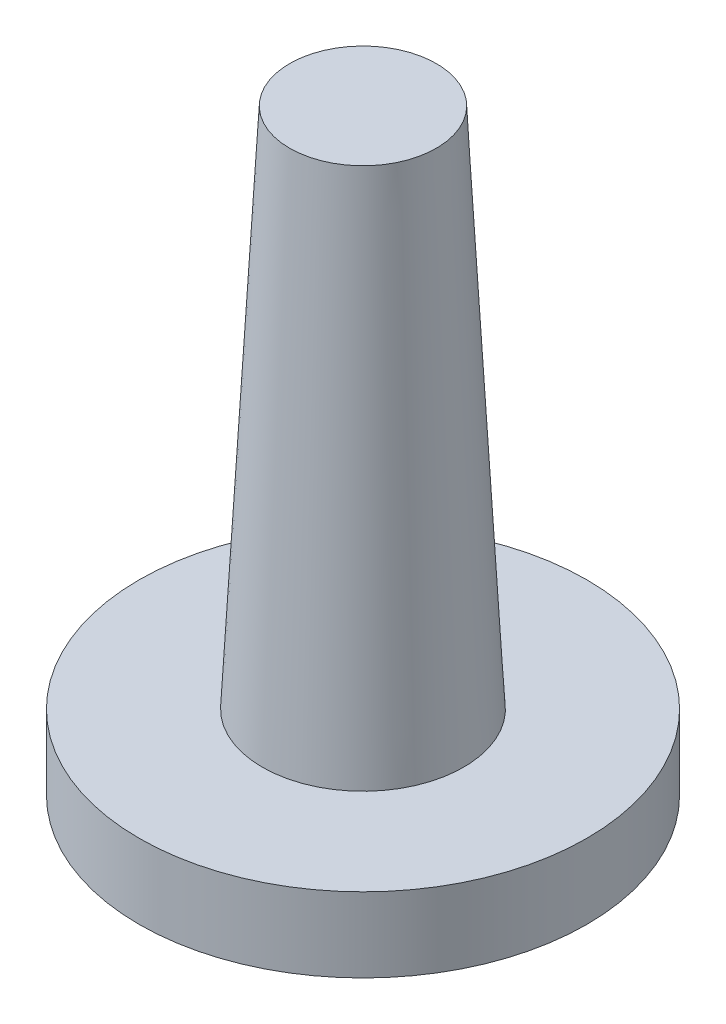
ISO-10303-21;
HEADER;
FILE_DESCRIPTION(('STEP AP214'),'2;1');
FILE_NAME('part.step','',(''),(''),'','','');
FILE_SCHEMA(('AUTOMOTIVE_DESIGN { 1 0 10303 214 1 1 1 1 }'));
ENDSEC;
DATA;
#1=APPLICATION_CONTEXT('core data for automotive mechanical design processes');
#2=APPLICATION_PROTOCOL_DEFINITION('international standard','automotive_design',2000,#1);
#3=PRODUCT_CONTEXT('',#1,'mechanical');
#4=PRODUCT('Part','Part','',(#3));
#5=PRODUCT_RELATED_PRODUCT_CATEGORY('part','',(#4));
#6=PRODUCT_DEFINITION_FORMATION('','',#4);
#7=PRODUCT_DEFINITION_CONTEXT('part definition',#1,'design');
#8=PRODUCT_DEFINITION('design','',#6,#7);
#9=PRODUCT_DEFINITION_SHAPE('','',#8);
#10=(LENGTH_UNIT() NAMED_UNIT(*) SI_UNIT(.MILLI.,.METRE.));
#11=(NAMED_UNIT(*) PLANE_ANGLE_UNIT() SI_UNIT($,.RADIAN.));
#12=(NAMED_UNIT(*) SI_UNIT($,.STERADIAN.) SOLID_ANGLE_UNIT());
#13=UNCERTAINTY_MEASURE_WITH_UNIT(LENGTH_MEASURE(1.E-05),#10,'distance_accuracy_value','');
#14=(GEOMETRIC_REPRESENTATION_CONTEXT(3) GLOBAL_UNCERTAINTY_ASSIGNED_CONTEXT((#13)) GLOBAL_UNIT_ASSIGNED_CONTEXT((#10,
#11,#12)) REPRESENTATION_CONTEXT('',''));
#15=CARTESIAN_POINT('',(0.,0.,0.));
#16=DIRECTION('',(0.,0.,1.));
#17=DIRECTION('',(1.,0.,0.));
#18=AXIS2_PLACEMENT_3D('',#15,#16,#17);
#19=CARTESIAN_POINT('',(0.,0.,0.));
#20=DIRECTION('',(0.,-1.,0.));
#21=DIRECTION('',(0.,0.,1.));
#22=AXIS2_PLACEMENT_3D('',#19,#20,#21);
#23=CONICAL_SURFACE('',#22,1.35,0.05235987755983);
#24=CARTESIAN_POINT('',(0.,7.,0.));
#25=DIRECTION('',(0.,1.,0.));
#26=DIRECTION('',(0.,0.,1.));
#27=AXIS2_PLACEMENT_3D('',#24,#25,#26);
#28=CIRCLE('',#27,0.983145545018711);
#29=CARTESIAN_POINT('',(0.,7.,0.983145545018711));
#30=VERTEX_POINT('',#29);
#31=EDGE_CURVE('E10',#30,#30,#28,.T.);
#32=ORIENTED_EDGE('',*,*,#31,.F.);
#33=EDGE_LOOP('',(#32));
#34=FACE_BOUND('',#33,.T.);
#35=CARTESIAN_POINT('',(0.,0.,0.));
#36=DIRECTION('',(0.,1.,0.));
#37=DIRECTION('',(0.,0.,1.));
#38=AXIS2_PLACEMENT_3D('',#35,#36,#37);
#39=CIRCLE('',#38,1.35);
#40=CARTESIAN_POINT('',(0.,0.,1.35));
#41=VERTEX_POINT('',#40);
#42=EDGE_CURVE('E37',#41,#41,#39,.T.);
#43=ORIENTED_EDGE('',*,*,#42,.T.);
#44=EDGE_LOOP('',(#43));
#45=FACE_BOUND('',#44,.T.);
#46=ADVANCED_FACE('F31',(#34,#45),#23,.T.);
#47=CARTESIAN_POINT('',(0.,7.,0.));
#48=DIRECTION('',(0.,1.,0.));
#49=DIRECTION('',(0.,0.,1.));
#50=AXIS2_PLACEMENT_3D('',#47,#48,#49);
#51=PLANE('',#50);
#52=ORIENTED_EDGE('',*,*,#31,.T.);
#53=EDGE_LOOP('',(#52));
#54=FACE_BOUND('',#53,.T.);
#55=ADVANCED_FACE('F56',(#54),#51,.T.);
#56=CARTESIAN_POINT('',(0.,-1.,0.));
#57=DIRECTION('',(0.,1.,0.));
#58=DIRECTION('',(0.,0.,1.));
#59=AXIS2_PLACEMENT_3D('',#56,#57,#58);
#60=CYLINDRICAL_SURFACE('',#59,3.);
#61=CARTESIAN_POINT('',(0.,-1.,0.));
#62=DIRECTION('',(0.,1.,0.));
#63=DIRECTION('',(0.,0.,1.));
#64=AXIS2_PLACEMENT_3D('',#61,#62,#63);
#65=CIRCLE('',#64,3.);
#66=CARTESIAN_POINT('',(0.,-1.,3.));
#67=VERTEX_POINT('',#66);
#68=EDGE_CURVE('E41',#67,#67,#65,.T.);
#69=ORIENTED_EDGE('',*,*,#68,.T.);
#70=EDGE_LOOP('',(#69));
#71=FACE_BOUND('',#70,.T.);
#72=CARTESIAN_POINT('',(0.,0.,0.));
#73=DIRECTION('',(0.,1.,0.));
#74=DIRECTION('',(0.,0.,1.));
#75=AXIS2_PLACEMENT_3D('',#72,#73,#74);
#76=CIRCLE('',#75,3.);
#77=CARTESIAN_POINT('',(0.,0.,3.));
#78=VERTEX_POINT('',#77);
#79=EDGE_CURVE('E45',#78,#78,#76,.T.);
#80=ORIENTED_EDGE('',*,*,#79,.F.);
#81=EDGE_LOOP('',(#80));
#82=FACE_BOUND('',#81,.T.);
#83=ADVANCED_FACE('F53',(#71,#82),#60,.T.);
#84=CARTESIAN_POINT('',(0.,-1.,0.));
#85=DIRECTION('',(0.,1.,0.));
#86=DIRECTION('',(0.,0.,1.));
#87=AXIS2_PLACEMENT_3D('',#84,#85,#86);
#88=PLANE('',#87);
#89=ORIENTED_EDGE('',*,*,#68,.F.);
#90=EDGE_LOOP('',(#89));
#91=FACE_BOUND('',#90,.T.);
#92=ADVANCED_FACE('F55',(#91),#88,.F.);
#93=CARTESIAN_POINT('',(0.,0.,0.));
#94=DIRECTION('',(0.,1.,0.));
#95=DIRECTION('',(0.,0.,1.));
#96=AXIS2_PLACEMENT_3D('',#93,#94,#95);
#97=PLANE('',#96);
#98=ORIENTED_EDGE('',*,*,#42,.F.);
#99=EDGE_LOOP('',(#98));
#100=FACE_BOUND('',#99,.T.);
#101=ORIENTED_EDGE('',*,*,#79,.T.);
#102=EDGE_LOOP('',(#101));
#103=FACE_BOUND('',#102,.T.);
#104=ADVANCED_FACE('F51',(#100,#103),#97,.T.);
#105=CLOSED_SHELL('',(#46,#55,#83,#92,#104));
#106=MANIFOLD_SOLID_BREP('B2',#105);
#107=ADVANCED_BREP_SHAPE_REPRESENTATION('',(#18,#106),#14);
#108=SHAPE_DEFINITION_REPRESENTATION(#9,#107);
ENDSEC;
END-ISO-10303-21;
